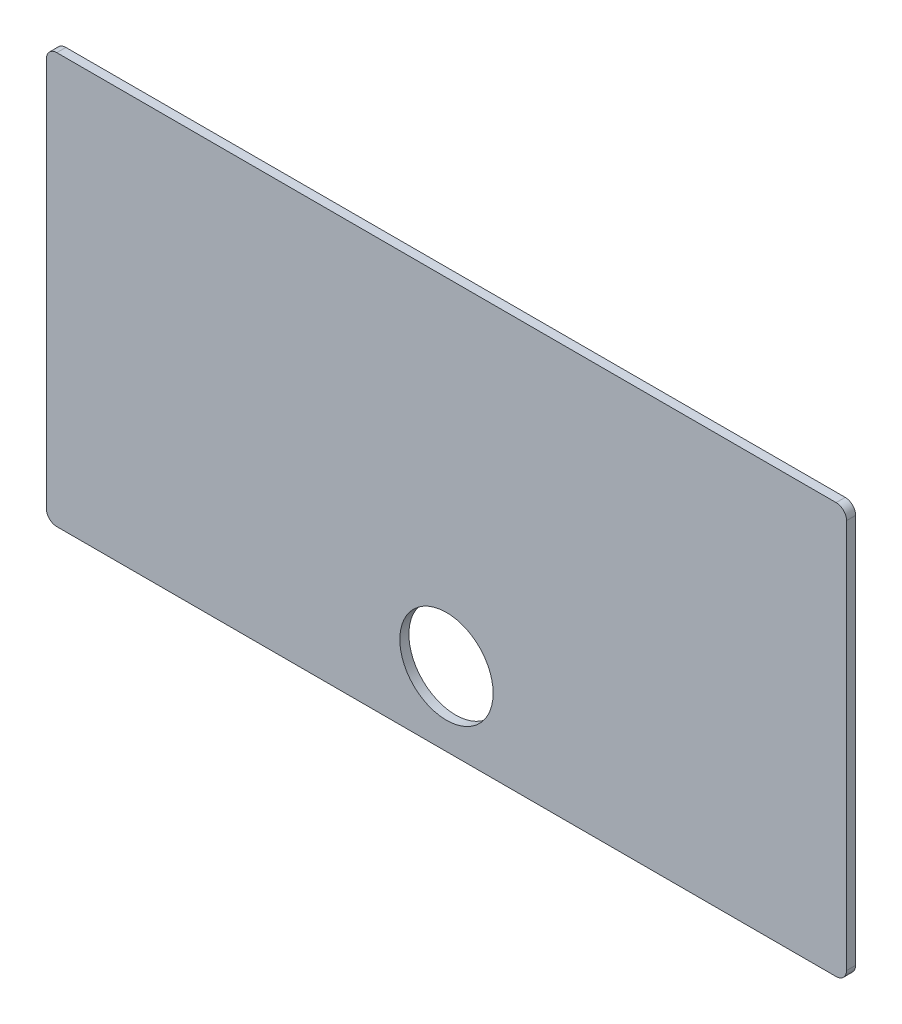
ISO-10303-21;
HEADER;
FILE_DESCRIPTION(('STEP AP214'),'2;1');
FILE_NAME('part.step','',(''),(''),'','','');
FILE_SCHEMA(('AUTOMOTIVE_DESIGN { 1 0 10303 214 1 1 1 1 }'));
ENDSEC;
DATA;
#1=APPLICATION_CONTEXT('core data for automotive mechanical design processes');
#2=APPLICATION_PROTOCOL_DEFINITION('international standard','automotive_design',2000,#1);
#3=PRODUCT_CONTEXT('',#1,'mechanical');
#4=PRODUCT('Part','Part','',(#3));
#5=PRODUCT_RELATED_PRODUCT_CATEGORY('part','',(#4));
#6=PRODUCT_DEFINITION_FORMATION('','',#4);
#7=PRODUCT_DEFINITION_CONTEXT('part definition',#1,'design');
#8=PRODUCT_DEFINITION('design','',#6,#7);
#9=PRODUCT_DEFINITION_SHAPE('','',#8);
#10=(LENGTH_UNIT() NAMED_UNIT(*) SI_UNIT(.MILLI.,.METRE.));
#11=(NAMED_UNIT(*) PLANE_ANGLE_UNIT() SI_UNIT($,.RADIAN.));
#12=(NAMED_UNIT(*) SI_UNIT($,.STERADIAN.) SOLID_ANGLE_UNIT());
#13=UNCERTAINTY_MEASURE_WITH_UNIT(LENGTH_MEASURE(1.E-05),#10,'distance_accuracy_value','');
#14=(GEOMETRIC_REPRESENTATION_CONTEXT(3) GLOBAL_UNCERTAINTY_ASSIGNED_CONTEXT((#13)) GLOBAL_UNIT_ASSIGNED_CONTEXT((#10,
#11,#12)) REPRESENTATION_CONTEXT('',''));
#15=CARTESIAN_POINT('',(0.,0.,0.));
#16=DIRECTION('',(0.,0.,1.));
#17=DIRECTION('',(1.,0.,0.));
#18=AXIS2_PLACEMENT_3D('',#15,#16,#17);
#19=CARTESIAN_POINT('',(0.,0.,0.));
#20=DIRECTION('',(0.,0.,1.));
#21=DIRECTION('',(1.,0.,0.));
#22=AXIS2_PLACEMENT_3D('',#19,#20,#21);
#23=PLANE('',#22);
#24=CARTESIAN_POINT('',(0.,-14.5,0.));
#25=DIRECTION('',(0.,0.,1.));
#26=DIRECTION('',(1.,0.,0.));
#27=AXIS2_PLACEMENT_3D('',#24,#25,#26);
#28=CIRCLE('',#27,5.15);
#29=CARTESIAN_POINT('',(5.15,-14.5,0.));
#30=VERTEX_POINT('',#29);
#31=EDGE_CURVE('E12',#30,#30,#28,.F.);
#32=ORIENTED_EDGE('',*,*,#31,.F.);
#33=EDGE_LOOP('',(#32));
#34=FACE_BOUND('',#33,.T.);
#35=CARTESIAN_POINT('',(-43.,-21.5,0.));
#36=DIRECTION('',(0.,0.,-1.));
#37=DIRECTION('',(-1.,0.,0.));
#38=AXIS2_PLACEMENT_3D('',#35,#36,#37);
#39=CIRCLE('',#38,1.15);
#40=CARTESIAN_POINT('',(-43.,-22.65,0.));
#41=VERTEX_POINT('',#40);
#42=CARTESIAN_POINT('',(-44.15,-21.5,0.));
#43=VERTEX_POINT('',#42);
#44=EDGE_CURVE('E178',#41,#43,#39,.T.);
#45=ORIENTED_EDGE('',*,*,#44,.T.);
#46=DIRECTION('',(0.,1.,0.));
#47=VECTOR('',#46,1.);
#48=CARTESIAN_POINT('',(-44.15,-21.5,0.));
#49=LINE('',#48,#47);
#50=CARTESIAN_POINT('',(-44.15,21.5,0.));
#51=VERTEX_POINT('',#50);
#52=EDGE_CURVE('E203',#43,#51,#49,.T.);
#53=ORIENTED_EDGE('',*,*,#52,.T.);
#54=CARTESIAN_POINT('',(-43.,21.5,0.));
#55=DIRECTION('',(0.,0.,-1.));
#56=DIRECTION('',(-1.,0.,0.));
#57=AXIS2_PLACEMENT_3D('',#54,#55,#56);
#58=CIRCLE('',#57,1.15);
#59=CARTESIAN_POINT('',(-43.,22.65,0.));
#60=VERTEX_POINT('',#59);
#61=EDGE_CURVE('E200',#51,#60,#58,.T.);
#62=ORIENTED_EDGE('',*,*,#61,.T.);
#63=DIRECTION('',(1.,0.,0.));
#64=VECTOR('',#63,1.);
#65=CARTESIAN_POINT('',(-43.,22.65,0.));
#66=LINE('',#65,#64);
#67=CARTESIAN_POINT('',(43.,22.65,0.));
#68=VERTEX_POINT('',#67);
#69=EDGE_CURVE('E198',#60,#68,#66,.T.);
#70=ORIENTED_EDGE('',*,*,#69,.T.);
#71=CARTESIAN_POINT('',(43.,21.5,0.));
#72=DIRECTION('',(0.,0.,-1.));
#73=DIRECTION('',(-1.,0.,0.));
#74=AXIS2_PLACEMENT_3D('',#71,#72,#73);
#75=CIRCLE('',#74,1.15);
#76=CARTESIAN_POINT('',(44.15,21.5,0.));
#77=VERTEX_POINT('',#76);
#78=EDGE_CURVE('E156',#68,#77,#75,.T.);
#79=ORIENTED_EDGE('',*,*,#78,.T.);
#80=DIRECTION('',(0.,-1.,0.));
#81=VECTOR('',#80,1.);
#82=CARTESIAN_POINT('',(44.15,21.5,0.));
#83=LINE('',#82,#81);
#84=CARTESIAN_POINT('',(44.15,-21.5,0.));
#85=VERTEX_POINT('',#84);
#86=EDGE_CURVE('E192',#77,#85,#83,.T.);
#87=ORIENTED_EDGE('',*,*,#86,.T.);
#88=CARTESIAN_POINT('',(43.,-21.5,0.));
#89=DIRECTION('',(0.,0.,-1.));
#90=DIRECTION('',(-1.,0.,0.));
#91=AXIS2_PLACEMENT_3D('',#88,#89,#90);
#92=CIRCLE('',#91,1.15);
#93=CARTESIAN_POINT('',(43.,-22.65,0.));
#94=VERTEX_POINT('',#93);
#95=EDGE_CURVE('E186',#85,#94,#92,.T.);
#96=ORIENTED_EDGE('',*,*,#95,.T.);
#97=DIRECTION('',(-1.,0.,0.));
#98=VECTOR('',#97,1.);
#99=CARTESIAN_POINT('',(43.,-22.65,0.));
#100=LINE('',#99,#98);
#101=EDGE_CURVE('E182',#94,#41,#100,.T.);
#102=ORIENTED_EDGE('',*,*,#101,.T.);
#103=EDGE_LOOP('',(#45,#53,#62,#70,#79,#87,#96,#102));
#104=FACE_BOUND('',#103,.T.);
#105=ADVANCED_FACE('F78',(#34,#104),#23,.F.);
#106=CARTESIAN_POINT('',(0.,0.,1.));
#107=DIRECTION('',(0.,0.,1.));
#108=DIRECTION('',(1.,0.,0.));
#109=AXIS2_PLACEMENT_3D('',#106,#107,#108);
#110=PLANE('',#109);
#111=CARTESIAN_POINT('',(0.,-14.5,1.));
#112=DIRECTION('',(0.,0.,1.));
#113=DIRECTION('',(1.,0.,0.));
#114=AXIS2_PLACEMENT_3D('',#111,#112,#113);
#115=CIRCLE('',#114,5.15);
#116=CARTESIAN_POINT('',(5.15,-14.5,1.));
#117=VERTEX_POINT('',#116);
#118=EDGE_CURVE('E85',#117,#117,#115,.T.);
#119=ORIENTED_EDGE('',*,*,#118,.F.);
#120=EDGE_LOOP('',(#119));
#121=FACE_BOUND('',#120,.T.);
#122=CARTESIAN_POINT('',(-43.,-21.5,1.));
#123=DIRECTION('',(0.,0.,1.));
#124=DIRECTION('',(1.,0.,0.));
#125=AXIS2_PLACEMENT_3D('',#122,#123,#124);
#126=CIRCLE('',#125,1.15);
#127=CARTESIAN_POINT('',(-43.,-22.65,1.));
#128=VERTEX_POINT('',#127);
#129=CARTESIAN_POINT('',(-44.15,-21.5,1.));
#130=VERTEX_POINT('',#129);
#131=EDGE_CURVE('E180',#128,#130,#126,.F.);
#132=ORIENTED_EDGE('',*,*,#131,.F.);
#133=DIRECTION('',(-1.,0.,0.));
#134=VECTOR('',#133,1.);
#135=CARTESIAN_POINT('',(43.,-22.65,1.));
#136=LINE('',#135,#134);
#137=CARTESIAN_POINT('',(43.,-22.65,1.));
#138=VERTEX_POINT('',#137);
#139=EDGE_CURVE('E171',#138,#128,#136,.T.);
#140=ORIENTED_EDGE('',*,*,#139,.F.);
#141=CARTESIAN_POINT('',(43.,-21.5,1.));
#142=DIRECTION('',(0.,0.,1.));
#143=DIRECTION('',(1.,0.,0.));
#144=AXIS2_PLACEMENT_3D('',#141,#142,#143);
#145=CIRCLE('',#144,1.15);
#146=CARTESIAN_POINT('',(44.15,-21.5,1.));
#147=VERTEX_POINT('',#146);
#148=EDGE_CURVE('E170',#147,#138,#145,.F.);
#149=ORIENTED_EDGE('',*,*,#148,.F.);
#150=DIRECTION('',(0.,-1.,0.));
#151=VECTOR('',#150,1.);
#152=CARTESIAN_POINT('',(44.15,21.5,1.));
#153=LINE('',#152,#151);
#154=CARTESIAN_POINT('',(44.15,21.5,1.));
#155=VERTEX_POINT('',#154);
#156=EDGE_CURVE('E146',#155,#147,#153,.T.);
#157=ORIENTED_EDGE('',*,*,#156,.F.);
#158=CARTESIAN_POINT('',(43.,21.5,1.));
#159=DIRECTION('',(0.,0.,1.));
#160=DIRECTION('',(1.,0.,0.));
#161=AXIS2_PLACEMENT_3D('',#158,#159,#160);
#162=CIRCLE('',#161,1.15);
#163=CARTESIAN_POINT('',(43.,22.65,1.));
#164=VERTEX_POINT('',#163);
#165=EDGE_CURVE('E139',#164,#155,#162,.F.);
#166=ORIENTED_EDGE('',*,*,#165,.F.);
#167=DIRECTION('',(1.,0.,0.));
#168=VECTOR('',#167,1.);
#169=CARTESIAN_POINT('',(-43.,22.65,1.));
#170=LINE('',#169,#168);
#171=CARTESIAN_POINT('',(-43.,22.65,1.));
#172=VERTEX_POINT('',#171);
#173=EDGE_CURVE('E143',#172,#164,#170,.T.);
#174=ORIENTED_EDGE('',*,*,#173,.F.);
#175=CARTESIAN_POINT('',(-43.,21.5,1.));
#176=DIRECTION('',(0.,0.,1.));
#177=DIRECTION('',(1.,0.,0.));
#178=AXIS2_PLACEMENT_3D('',#175,#176,#177);
#179=CIRCLE('',#178,1.15);
#180=CARTESIAN_POINT('',(-44.15,21.5,1.));
#181=VERTEX_POINT('',#180);
#182=EDGE_CURVE('E98',#181,#172,#179,.F.);
#183=ORIENTED_EDGE('',*,*,#182,.F.);
#184=DIRECTION('',(0.,1.,0.));
#185=VECTOR('',#184,1.);
#186=CARTESIAN_POINT('',(-44.15,-21.5,1.));
#187=LINE('',#186,#185);
#188=EDGE_CURVE('E92',#130,#181,#187,.T.);
#189=ORIENTED_EDGE('',*,*,#188,.F.);
#190=EDGE_LOOP('',(#132,#140,#149,#157,#166,#174,#183,#189));
#191=FACE_BOUND('',#190,.T.);
#192=ADVANCED_FACE('F141',(#121,#191),#110,.T.);
#193=CARTESIAN_POINT('',(0.,-14.5,-15.556349186104));
#194=DIRECTION('',(0.,0.,1.));
#195=DIRECTION('',(1.,0.,0.));
#196=AXIS2_PLACEMENT_3D('',#193,#194,#195);
#197=CYLINDRICAL_SURFACE('',#196,5.15);
#198=ORIENTED_EDGE('',*,*,#31,.T.);
#199=EDGE_LOOP('',(#198));
#200=FACE_BOUND('',#199,.T.);
#201=ORIENTED_EDGE('',*,*,#118,.T.);
#202=EDGE_LOOP('',(#201));
#203=FACE_BOUND('',#202,.T.);
#204=ADVANCED_FACE('F242',(#200,#203),#197,.F.);
#205=CARTESIAN_POINT('',(-43.,-21.5,100.242027387594));
#206=DIRECTION('',(0.,0.,-1.));
#207=DIRECTION('',(-1.,0.,0.));
#208=AXIS2_PLACEMENT_3D('',#205,#206,#207);
#209=CYLINDRICAL_SURFACE('',#208,1.15);
#210=DIRECTION('',(0.,0.,-1.));
#211=VECTOR('',#210,1.);
#212=CARTESIAN_POINT('',(-43.,-22.65,100.242027387594));
#213=LINE('',#212,#211);
#214=EDGE_CURVE('E168',#128,#41,#213,.T.);
#215=ORIENTED_EDGE('',*,*,#214,.F.);
#216=ORIENTED_EDGE('',*,*,#131,.T.);
#217=DIRECTION('',(0.,0.,-1.));
#218=VECTOR('',#217,1.);
#219=CARTESIAN_POINT('',(-44.15,-21.5,100.242027387594));
#220=LINE('',#219,#218);
#221=EDGE_CURVE('E179',#130,#43,#220,.T.);
#222=ORIENTED_EDGE('',*,*,#221,.T.);
#223=ORIENTED_EDGE('',*,*,#44,.F.);
#224=EDGE_LOOP('',(#215,#216,#222,#223));
#225=FACE_BOUND('',#224,.T.);
#226=ADVANCED_FACE('F227',(#225),#209,.T.);
#227=CARTESIAN_POINT('',(43.,-22.65,100.242027387594));
#228=DIRECTION('',(0.,-1.,0.));
#229=DIRECTION('',(0.,0.,-1.));
#230=AXIS2_PLACEMENT_3D('',#227,#228,#229);
#231=PLANE('',#230);
#232=DIRECTION('',(0.,0.,-1.));
#233=VECTOR('',#232,1.);
#234=CARTESIAN_POINT('',(43.,-22.65,100.242027387594));
#235=LINE('',#234,#233);
#236=EDGE_CURVE('E172',#138,#94,#235,.T.);
#237=ORIENTED_EDGE('',*,*,#236,.F.);
#238=ORIENTED_EDGE('',*,*,#139,.T.);
#239=ORIENTED_EDGE('',*,*,#214,.T.);
#240=ORIENTED_EDGE('',*,*,#101,.F.);
#241=EDGE_LOOP('',(#237,#238,#239,#240));
#242=FACE_BOUND('',#241,.T.);
#243=ADVANCED_FACE('F230',(#242),#231,.T.);
#244=CARTESIAN_POINT('',(43.,-21.5,100.242027387594));
#245=DIRECTION('',(0.,0.,-1.));
#246=DIRECTION('',(-1.,0.,0.));
#247=AXIS2_PLACEMENT_3D('',#244,#245,#246);
#248=CYLINDRICAL_SURFACE('',#247,1.15);
#249=DIRECTION('',(0.,0.,-1.));
#250=VECTOR('',#249,1.);
#251=CARTESIAN_POINT('',(44.15,-21.5,100.242027387594));
#252=LINE('',#251,#250);
#253=EDGE_CURVE('E150',#147,#85,#252,.T.);
#254=ORIENTED_EDGE('',*,*,#253,.F.);
#255=ORIENTED_EDGE('',*,*,#148,.T.);
#256=ORIENTED_EDGE('',*,*,#236,.T.);
#257=ORIENTED_EDGE('',*,*,#95,.F.);
#258=EDGE_LOOP('',(#254,#255,#256,#257));
#259=FACE_BOUND('',#258,.T.);
#260=ADVANCED_FACE('F232',(#259),#248,.T.);
#261=CARTESIAN_POINT('',(44.15,21.5,100.242027387594));
#262=DIRECTION('',(1.,0.,0.));
#263=DIRECTION('',(0.,0.,-1.));
#264=AXIS2_PLACEMENT_3D('',#261,#262,#263);
#265=PLANE('',#264);
#266=DIRECTION('',(0.,0.,-1.));
#267=VECTOR('',#266,1.);
#268=CARTESIAN_POINT('',(44.15,21.5,100.242027387594));
#269=LINE('',#268,#267);
#270=EDGE_CURVE('E149',#155,#77,#269,.T.);
#271=ORIENTED_EDGE('',*,*,#270,.F.);
#272=ORIENTED_EDGE('',*,*,#156,.T.);
#273=ORIENTED_EDGE('',*,*,#253,.T.);
#274=ORIENTED_EDGE('',*,*,#86,.F.);
#275=EDGE_LOOP('',(#271,#272,#273,#274));
#276=FACE_BOUND('',#275,.T.);
#277=ADVANCED_FACE('F213',(#276),#265,.T.);
#278=CARTESIAN_POINT('',(43.,21.5,100.242027387594));
#279=DIRECTION('',(0.,0.,-1.));
#280=DIRECTION('',(-1.,0.,0.));
#281=AXIS2_PLACEMENT_3D('',#278,#279,#280);
#282=CYLINDRICAL_SURFACE('',#281,1.15);
#283=DIRECTION('',(0.,0.,-1.));
#284=VECTOR('',#283,1.);
#285=CARTESIAN_POINT('',(43.,22.65,100.242027387594));
#286=LINE('',#285,#284);
#287=EDGE_CURVE('E153',#164,#68,#286,.T.);
#288=ORIENTED_EDGE('',*,*,#287,.F.);
#289=ORIENTED_EDGE('',*,*,#165,.T.);
#290=ORIENTED_EDGE('',*,*,#270,.T.);
#291=ORIENTED_EDGE('',*,*,#78,.F.);
#292=EDGE_LOOP('',(#288,#289,#290,#291));
#293=FACE_BOUND('',#292,.T.);
#294=ADVANCED_FACE('F154',(#293),#282,.T.);
#295=CARTESIAN_POINT('',(-43.,22.65,100.242027387594));
#296=DIRECTION('',(0.,1.,0.));
#297=DIRECTION('',(0.,0.,1.));
#298=AXIS2_PLACEMENT_3D('',#295,#296,#297);
#299=PLANE('',#298);
#300=DIRECTION('',(0.,0.,-1.));
#301=VECTOR('',#300,1.);
#302=CARTESIAN_POINT('',(-43.,22.65,100.242027387594));
#303=LINE('',#302,#301);
#304=EDGE_CURVE('E162',#172,#60,#303,.T.);
#305=ORIENTED_EDGE('',*,*,#304,.F.);
#306=ORIENTED_EDGE('',*,*,#173,.T.);
#307=ORIENTED_EDGE('',*,*,#287,.T.);
#308=ORIENTED_EDGE('',*,*,#69,.F.);
#309=EDGE_LOOP('',(#305,#306,#307,#308));
#310=FACE_BOUND('',#309,.T.);
#311=ADVANCED_FACE('F161',(#310),#299,.T.);
#312=CARTESIAN_POINT('',(-43.,21.5,100.242027387594));
#313=DIRECTION('',(0.,0.,-1.));
#314=DIRECTION('',(-1.,0.,0.));
#315=AXIS2_PLACEMENT_3D('',#312,#313,#314);
#316=CYLINDRICAL_SURFACE('',#315,1.15);
#317=DIRECTION('',(0.,0.,-1.));
#318=VECTOR('',#317,1.);
#319=CARTESIAN_POINT('',(-44.15,21.5,100.242027387594));
#320=LINE('',#319,#318);
#321=EDGE_CURVE('E176',#181,#51,#320,.T.);
#322=ORIENTED_EDGE('',*,*,#321,.F.);
#323=ORIENTED_EDGE('',*,*,#182,.T.);
#324=ORIENTED_EDGE('',*,*,#304,.T.);
#325=ORIENTED_EDGE('',*,*,#61,.F.);
#326=EDGE_LOOP('',(#322,#323,#324,#325));
#327=FACE_BOUND('',#326,.T.);
#328=ADVANCED_FACE('F220',(#327),#316,.T.);
#329=CARTESIAN_POINT('',(-44.15,-21.5,100.242027387594));
#330=DIRECTION('',(-1.,0.,0.));
#331=DIRECTION('',(0.,-1.,0.));
#332=AXIS2_PLACEMENT_3D('',#329,#330,#331);
#333=PLANE('',#332);
#334=ORIENTED_EDGE('',*,*,#221,.F.);
#335=ORIENTED_EDGE('',*,*,#188,.T.);
#336=ORIENTED_EDGE('',*,*,#321,.T.);
#337=ORIENTED_EDGE('',*,*,#52,.F.);
#338=EDGE_LOOP('',(#334,#335,#336,#337));
#339=FACE_BOUND('',#338,.T.);
#340=ADVANCED_FACE('F223',(#339),#333,.T.);
#341=CLOSED_SHELL('',(#105,#192,#204,#226,#243,#260,#277,#294,#311,#328,#340));
#342=MANIFOLD_SOLID_BREP('B2',#341);
#343=ADVANCED_BREP_SHAPE_REPRESENTATION('',(#18,#342),#14);
#344=SHAPE_DEFINITION_REPRESENTATION(#9,#343);
ENDSEC;
END-ISO-10303-21;
